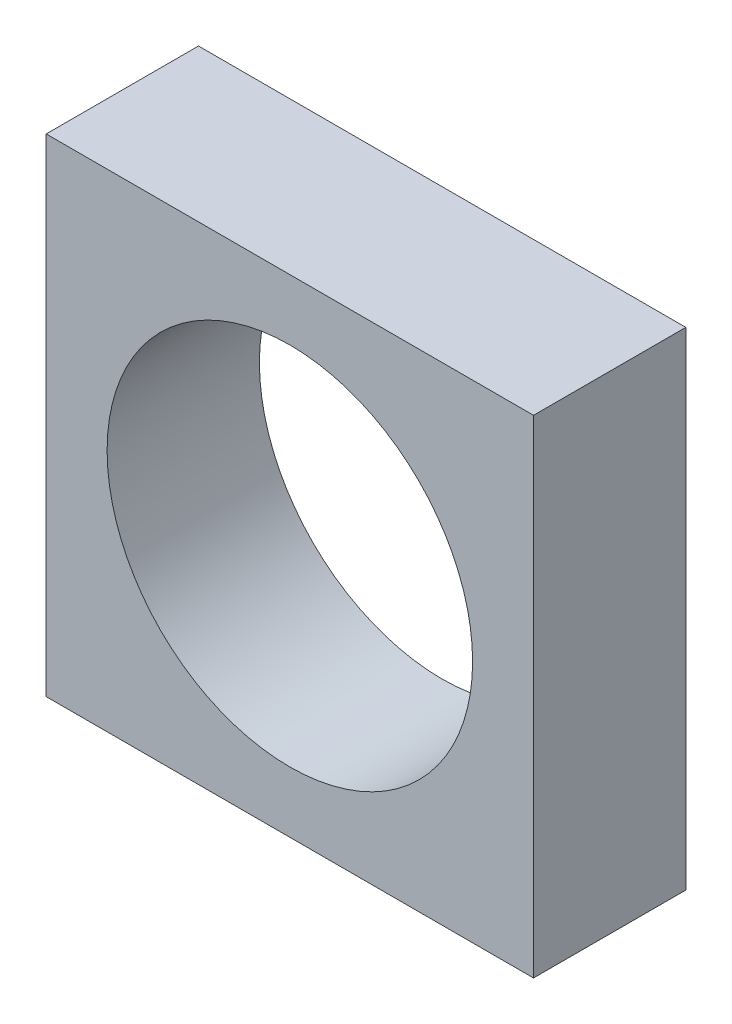
ISO-10303-21;
HEADER;
FILE_DESCRIPTION(('STEP AP214'),'2;1');
FILE_NAME('part.step','',(''),(''),'','','');
FILE_SCHEMA(('AUTOMOTIVE_DESIGN { 1 0 10303 214 1 1 1 1 }'));
ENDSEC;
DATA;
#1=APPLICATION_CONTEXT('core data for automotive mechanical design processes');
#2=APPLICATION_PROTOCOL_DEFINITION('international standard','automotive_design',2000,#1);
#3=PRODUCT_CONTEXT('',#1,'mechanical');
#4=PRODUCT('Part','Part','',(#3));
#5=PRODUCT_RELATED_PRODUCT_CATEGORY('part','',(#4));
#6=PRODUCT_DEFINITION_FORMATION('','',#4);
#7=PRODUCT_DEFINITION_CONTEXT('part definition',#1,'design');
#8=PRODUCT_DEFINITION('design','',#6,#7);
#9=PRODUCT_DEFINITION_SHAPE('','',#8);
#10=(LENGTH_UNIT() NAMED_UNIT(*) SI_UNIT(.MILLI.,.METRE.));
#11=(NAMED_UNIT(*) PLANE_ANGLE_UNIT() SI_UNIT($,.RADIAN.));
#12=(NAMED_UNIT(*) SI_UNIT($,.STERADIAN.) SOLID_ANGLE_UNIT());
#13=UNCERTAINTY_MEASURE_WITH_UNIT(LENGTH_MEASURE(1.E-05),#10,'distance_accuracy_value','');
#14=(GEOMETRIC_REPRESENTATION_CONTEXT(3) GLOBAL_UNCERTAINTY_ASSIGNED_CONTEXT((#13)) GLOBAL_UNIT_ASSIGNED_CONTEXT((#10,
#11,#12)) REPRESENTATION_CONTEXT('',''));
#15=CARTESIAN_POINT('',(0.,0.,0.));
#16=DIRECTION('',(0.,0.,1.));
#17=DIRECTION('',(1.,0.,0.));
#18=AXIS2_PLACEMENT_3D('',#15,#16,#17);
#19=CARTESIAN_POINT('',(0.,0.,5.));
#20=DIRECTION('',(0.,0.,-1.));
#21=DIRECTION('',(-1.,0.,0.));
#22=AXIS2_PLACEMENT_3D('',#19,#20,#21);
#23=PLANE('',#22);
#24=DIRECTION('',(0.,-1.,0.));
#25=VECTOR('',#24,1.);
#26=CARTESIAN_POINT('',(-8.,8.,5.));
#27=LINE('',#26,#25);
#28=CARTESIAN_POINT('',(-8.,8.,5.));
#29=VERTEX_POINT('',#28);
#30=CARTESIAN_POINT('',(-8.,-8.,5.));
#31=VERTEX_POINT('',#30);
#32=EDGE_CURVE('E87',#29,#31,#27,.T.);
#33=ORIENTED_EDGE('',*,*,#32,.T.);
#34=DIRECTION('',(1.,0.,0.));
#35=VECTOR('',#34,1.);
#36=CARTESIAN_POINT('',(8.,-8.,5.));
#37=LINE('',#36,#35);
#38=CARTESIAN_POINT('',(8.,-8.,5.));
#39=VERTEX_POINT('',#38);
#40=EDGE_CURVE('E82',#31,#39,#37,.T.);
#41=ORIENTED_EDGE('',*,*,#40,.T.);
#42=DIRECTION('',(0.,1.,0.));
#43=VECTOR('',#42,1.);
#44=CARTESIAN_POINT('',(8.,8.,5.));
#45=LINE('',#44,#43);
#46=CARTESIAN_POINT('',(8.,8.,5.));
#47=VERTEX_POINT('',#46);
#48=EDGE_CURVE('E85',#39,#47,#45,.T.);
#49=ORIENTED_EDGE('',*,*,#48,.T.);
#50=DIRECTION('',(-1.,0.,0.));
#51=VECTOR('',#50,1.);
#52=CARTESIAN_POINT('',(8.,8.,5.));
#53=LINE('',#52,#51);
#54=EDGE_CURVE('E52',#47,#29,#53,.T.);
#55=ORIENTED_EDGE('',*,*,#54,.T.);
#56=EDGE_LOOP('',(#33,#41,#49,#55));
#57=FACE_BOUND('',#56,.T.);
#58=CARTESIAN_POINT('',(0.,0.,5.));
#59=DIRECTION('',(0.,0.,1.));
#60=DIRECTION('',(1.,0.,0.));
#61=AXIS2_PLACEMENT_3D('',#58,#59,#60);
#62=CIRCLE('',#61,6.);
#63=CARTESIAN_POINT('',(6.,0.,5.));
#64=VERTEX_POINT('',#63);
#65=EDGE_CURVE('E102',#64,#64,#62,.T.);
#66=ORIENTED_EDGE('',*,*,#65,.F.);
#67=EDGE_LOOP('',(#66));
#68=FACE_BOUND('',#67,.T.);
#69=ADVANCED_FACE('F35',(#57,#68),#23,.F.);
#70=CARTESIAN_POINT('',(0.,0.,0.));
#71=DIRECTION('',(0.,0.,-1.));
#72=DIRECTION('',(-1.,0.,0.));
#73=AXIS2_PLACEMENT_3D('',#70,#71,#72);
#74=PLANE('',#73);
#75=DIRECTION('',(0.,-1.,0.));
#76=VECTOR('',#75,1.);
#77=CARTESIAN_POINT('',(-8.,8.,0.));
#78=LINE('',#77,#76);
#79=CARTESIAN_POINT('',(-8.,8.,0.));
#80=VERTEX_POINT('',#79);
#81=CARTESIAN_POINT('',(-8.,-8.,0.));
#82=VERTEX_POINT('',#81);
#83=EDGE_CURVE('E99',#80,#82,#78,.T.);
#84=ORIENTED_EDGE('',*,*,#83,.F.);
#85=DIRECTION('',(-1.,0.,0.));
#86=VECTOR('',#85,1.);
#87=CARTESIAN_POINT('',(8.,8.,0.));
#88=LINE('',#87,#86);
#89=CARTESIAN_POINT('',(8.,8.,0.));
#90=VERTEX_POINT('',#89);
#91=EDGE_CURVE('E75',#90,#80,#88,.T.);
#92=ORIENTED_EDGE('',*,*,#91,.F.);
#93=DIRECTION('',(0.,1.,0.));
#94=VECTOR('',#93,1.);
#95=CARTESIAN_POINT('',(8.,8.,0.));
#96=LINE('',#95,#94);
#97=CARTESIAN_POINT('',(8.,-8.,0.));
#98=VERTEX_POINT('',#97);
#99=EDGE_CURVE('E69',#98,#90,#96,.T.);
#100=ORIENTED_EDGE('',*,*,#99,.F.);
#101=DIRECTION('',(1.,0.,0.));
#102=VECTOR('',#101,1.);
#103=CARTESIAN_POINT('',(8.,-8.,0.));
#104=LINE('',#103,#102);
#105=EDGE_CURVE('E91',#82,#98,#104,.T.);
#106=ORIENTED_EDGE('',*,*,#105,.F.);
#107=EDGE_LOOP('',(#84,#92,#100,#106));
#108=FACE_BOUND('',#107,.T.);
#109=CARTESIAN_POINT('',(0.,0.,0.));
#110=DIRECTION('',(0.,0.,1.));
#111=DIRECTION('',(1.,0.,0.));
#112=AXIS2_PLACEMENT_3D('',#109,#110,#111);
#113=CIRCLE('',#112,6.);
#114=CARTESIAN_POINT('',(6.,0.,0.));
#115=VERTEX_POINT('',#114);
#116=EDGE_CURVE('E114',#115,#115,#113,.T.);
#117=ORIENTED_EDGE('',*,*,#116,.T.);
#118=EDGE_LOOP('',(#117));
#119=FACE_BOUND('',#118,.T.);
#120=ADVANCED_FACE('F110',(#108,#119),#74,.T.);
#121=CARTESIAN_POINT('',(-8.,8.,5.));
#122=DIRECTION('',(1.,0.,0.));
#123=DIRECTION('',(0.,1.,0.));
#124=AXIS2_PLACEMENT_3D('',#121,#122,#123);
#125=PLANE('',#124);
#126=ORIENTED_EDGE('',*,*,#83,.T.);
#127=DIRECTION('',(0.,0.,-1.));
#128=VECTOR('',#127,1.);
#129=CARTESIAN_POINT('',(-8.,-8.,5.));
#130=LINE('',#129,#128);
#131=EDGE_CURVE('E11',#31,#82,#130,.T.);
#132=ORIENTED_EDGE('',*,*,#131,.F.);
#133=ORIENTED_EDGE('',*,*,#32,.F.);
#134=DIRECTION('',(0.,0.,-1.));
#135=VECTOR('',#134,1.);
#136=CARTESIAN_POINT('',(-8.,8.,5.));
#137=LINE('',#136,#135);
#138=EDGE_CURVE('E95',#29,#80,#137,.T.);
#139=ORIENTED_EDGE('',*,*,#138,.T.);
#140=EDGE_LOOP('',(#126,#132,#133,#139));
#141=FACE_BOUND('',#140,.T.);
#142=ADVANCED_FACE('F37',(#141),#125,.F.);
#143=CARTESIAN_POINT('',(8.,-8.,5.));
#144=DIRECTION('',(0.,1.,0.));
#145=DIRECTION('',(0.,0.,1.));
#146=AXIS2_PLACEMENT_3D('',#143,#144,#145);
#147=PLANE('',#146);
#148=ORIENTED_EDGE('',*,*,#105,.T.);
#149=DIRECTION('',(0.,0.,-1.));
#150=VECTOR('',#149,1.);
#151=CARTESIAN_POINT('',(8.,-8.,5.));
#152=LINE('',#151,#150);
#153=EDGE_CURVE('E44',#39,#98,#152,.T.);
#154=ORIENTED_EDGE('',*,*,#153,.F.);
#155=ORIENTED_EDGE('',*,*,#40,.F.);
#156=ORIENTED_EDGE('',*,*,#131,.T.);
#157=EDGE_LOOP('',(#148,#154,#155,#156));
#158=FACE_BOUND('',#157,.T.);
#159=ADVANCED_FACE('F90',(#158),#147,.F.);
#160=CARTESIAN_POINT('',(8.,8.,5.));
#161=DIRECTION('',(-1.,0.,0.));
#162=DIRECTION('',(0.,-1.,0.));
#163=AXIS2_PLACEMENT_3D('',#160,#161,#162);
#164=PLANE('',#163);
#165=ORIENTED_EDGE('',*,*,#99,.T.);
#166=DIRECTION('',(0.,0.,-1.));
#167=VECTOR('',#166,1.);
#168=CARTESIAN_POINT('',(8.,8.,5.));
#169=LINE('',#168,#167);
#170=EDGE_CURVE('E92',#47,#90,#169,.T.);
#171=ORIENTED_EDGE('',*,*,#170,.F.);
#172=ORIENTED_EDGE('',*,*,#48,.F.);
#173=ORIENTED_EDGE('',*,*,#153,.T.);
#174=EDGE_LOOP('',(#165,#171,#172,#173));
#175=FACE_BOUND('',#174,.T.);
#176=ADVANCED_FACE('F93',(#175),#164,.F.);
#177=CARTESIAN_POINT('',(8.,8.,5.));
#178=DIRECTION('',(0.,-1.,0.));
#179=DIRECTION('',(1.,0.,0.));
#180=AXIS2_PLACEMENT_3D('',#177,#178,#179);
#181=PLANE('',#180);
#182=ORIENTED_EDGE('',*,*,#91,.T.);
#183=ORIENTED_EDGE('',*,*,#138,.F.);
#184=ORIENTED_EDGE('',*,*,#54,.F.);
#185=ORIENTED_EDGE('',*,*,#170,.T.);
#186=EDGE_LOOP('',(#182,#183,#184,#185));
#187=FACE_BOUND('',#186,.T.);
#188=ADVANCED_FACE('F107',(#187),#181,.F.);
#189=CARTESIAN_POINT('',(0.,0.,5.));
#190=DIRECTION('',(0.,0.,-1.));
#191=DIRECTION('',(-1.,0.,0.));
#192=AXIS2_PLACEMENT_3D('',#189,#190,#191);
#193=CYLINDRICAL_SURFACE('',#192,6.);
#194=ORIENTED_EDGE('',*,*,#65,.T.);
#195=EDGE_LOOP('',(#194));
#196=FACE_BOUND('',#195,.T.);
#197=ORIENTED_EDGE('',*,*,#116,.F.);
#198=EDGE_LOOP('',(#197));
#199=FACE_BOUND('',#198,.T.);
#200=ADVANCED_FACE('F120',(#196,#199),#193,.F.);
#201=CLOSED_SHELL('',(#69,#120,#142,#159,#176,#188,#200));
#202=MANIFOLD_SOLID_BREP('B2',#201);
#203=ADVANCED_BREP_SHAPE_REPRESENTATION('',(#18,#202),#14);
#204=SHAPE_DEFINITION_REPRESENTATION(#9,#203);
ENDSEC;
END-ISO-10303-21;
